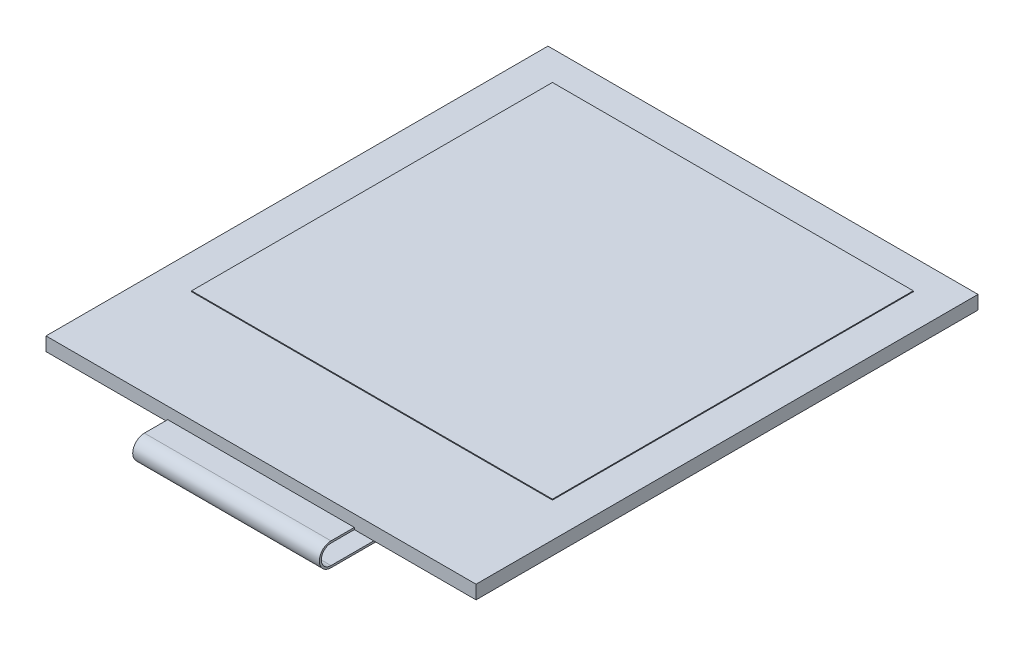
ISO-10303-21;
HEADER;
FILE_DESCRIPTION(('STEP AP214'),'2;1');
FILE_NAME('part.step','',(''),(''),'','','');
FILE_SCHEMA(('AUTOMOTIVE_DESIGN { 1 0 10303 214 1 1 1 1 }'));
ENDSEC;
DATA;
#1=APPLICATION_CONTEXT('core data for automotive mechanical design processes');
#2=APPLICATION_PROTOCOL_DEFINITION('international standard','automotive_design',2000,#1);
#3=PRODUCT_CONTEXT('',#1,'mechanical');
#4=PRODUCT('Part','Part','',(#3));
#5=PRODUCT_RELATED_PRODUCT_CATEGORY('part','',(#4));
#6=PRODUCT_DEFINITION_FORMATION('','',#4);
#7=PRODUCT_DEFINITION_CONTEXT('part definition',#1,'design');
#8=PRODUCT_DEFINITION('design','',#6,#7);
#9=PRODUCT_DEFINITION_SHAPE('','',#8);
#10=(LENGTH_UNIT() NAMED_UNIT(*) SI_UNIT(.MILLI.,.METRE.));
#11=(NAMED_UNIT(*) PLANE_ANGLE_UNIT() SI_UNIT($,.RADIAN.));
#12=(NAMED_UNIT(*) SI_UNIT($,.STERADIAN.) SOLID_ANGLE_UNIT());
#13=UNCERTAINTY_MEASURE_WITH_UNIT(LENGTH_MEASURE(1.E-05),#10,'distance_accuracy_value','');
#14=(GEOMETRIC_REPRESENTATION_CONTEXT(3) GLOBAL_UNCERTAINTY_ASSIGNED_CONTEXT((#13)) GLOBAL_UNIT_ASSIGNED_CONTEXT((#10,
#11,#12)) REPRESENTATION_CONTEXT('',''));
#15=CARTESIAN_POINT('',(0.,0.,0.));
#16=DIRECTION('',(0.,0.,1.));
#17=DIRECTION('',(1.,0.,0.));
#18=AXIS2_PLACEMENT_3D('',#15,#16,#17);
#19=CARTESIAN_POINT('',(-4.8,-1.1,16.19));
#20=DIRECTION('',(0.,-1.,0.));
#21=DIRECTION('',(0.,0.,-1.));
#22=AXIS2_PLACEMENT_3D('',#19,#20,#21);
#23=PLANE('',#22);
#24=DIRECTION('',(0.,0.,-1.));
#25=VECTOR('',#24,1.);
#26=CARTESIAN_POINT('',(-2.75,-1.1,12.76));
#27=LINE('',#26,#25);
#28=CARTESIAN_POINT('',(-2.75,-1.1,12.76));
#29=VERTEX_POINT('',#28);
#30=CARTESIAN_POINT('',(-2.75,-1.1,9.26));
#31=VERTEX_POINT('',#30);
#32=EDGE_CURVE('E59',#29,#31,#27,.T.);
#33=ORIENTED_EDGE('',*,*,#32,.T.);
#34=DIRECTION('',(-1.,0.,0.));
#35=VECTOR('',#34,1.);
#36=CARTESIAN_POINT('',(-2.75,-1.1,9.26));
#37=LINE('',#36,#35);
#38=CARTESIAN_POINT('',(2.75,-1.1,9.26));
#39=VERTEX_POINT('',#38);
#40=EDGE_CURVE('E63',#39,#31,#37,.T.);
#41=ORIENTED_EDGE('',*,*,#40,.F.);
#42=DIRECTION('',(0.,0.,1.));
#43=VECTOR('',#42,1.);
#44=CARTESIAN_POINT('',(2.75,-1.1,12.76));
#45=LINE('',#44,#43);
#46=CARTESIAN_POINT('',(2.75,-1.1,12.76));
#47=VERTEX_POINT('',#46);
#48=EDGE_CURVE('E237',#39,#47,#45,.T.);
#49=ORIENTED_EDGE('',*,*,#48,.T.);
#50=DIRECTION('',(1.,0.,0.));
#51=VECTOR('',#50,1.);
#52=CARTESIAN_POINT('',(-4.8,-1.1,12.76));
#53=LINE('',#52,#51);
#54=CARTESIAN_POINT('',(4.8,-1.1,12.76));
#55=VERTEX_POINT('',#54);
#56=EDGE_CURVE('E335',#47,#55,#53,.T.);
#57=ORIENTED_EDGE('',*,*,#56,.T.);
#58=DIRECTION('',(0.,0.,-1.));
#59=VECTOR('',#58,1.);
#60=CARTESIAN_POINT('',(4.8,-1.1,16.19));
#61=LINE('',#60,#59);
#62=CARTESIAN_POINT('',(4.8,-1.1,16.19));
#63=VERTEX_POINT('',#62);
#64=EDGE_CURVE('E268',#63,#55,#61,.T.);
#65=ORIENTED_EDGE('',*,*,#64,.F.);
#66=DIRECTION('',(1.,0.,0.));
#67=VECTOR('',#66,1.);
#68=CARTESIAN_POINT('',(-4.8,-1.1,16.19));
#69=LINE('',#68,#67);
#70=CARTESIAN_POINT('',(-4.8,-1.1,16.19));
#71=VERTEX_POINT('',#70);
#72=EDGE_CURVE('E336',#71,#63,#69,.T.);
#73=ORIENTED_EDGE('',*,*,#72,.F.);
#74=DIRECTION('',(0.,0.,-1.));
#75=VECTOR('',#74,1.);
#76=CARTESIAN_POINT('',(-4.8,-1.1,16.19));
#77=LINE('',#76,#75);
#78=CARTESIAN_POINT('',(-4.8,-1.1,12.76));
#79=VERTEX_POINT('',#78);
#80=EDGE_CURVE('E299',#71,#79,#77,.T.);
#81=ORIENTED_EDGE('',*,*,#80,.T.);
#82=EDGE_CURVE('E332',#79,#29,#53,.T.);
#83=ORIENTED_EDGE('',*,*,#82,.T.);
#84=EDGE_LOOP('',(#33,#41,#49,#57,#65,#73,#81,#83));
#85=FACE_BOUND('',#84,.T.);
#86=ADVANCED_FACE('F43',(#85),#23,.T.);
#87=CARTESIAN_POINT('',(-4.8,-1.,12.76));
#88=DIRECTION('',(0.,0.,-1.));
#89=DIRECTION('',(-1.,0.,0.));
#90=AXIS2_PLACEMENT_3D('',#87,#88,#89);
#91=PLANE('',#90);
#92=DIRECTION('',(1.,0.,0.));
#93=VECTOR('',#92,1.);
#94=CARTESIAN_POINT('',(-4.8,-1.,12.76));
#95=LINE('',#94,#93);
#96=CARTESIAN_POINT('',(-4.8,-1.,12.76));
#97=VERTEX_POINT('',#96);
#98=CARTESIAN_POINT('',(-2.75,-1.,12.76));
#99=VERTEX_POINT('',#98);
#100=EDGE_CURVE('E327',#97,#99,#95,.T.);
#101=ORIENTED_EDGE('',*,*,#100,.T.);
#102=DIRECTION('',(0.,-1.,0.));
#103=VECTOR('',#102,1.);
#104=CARTESIAN_POINT('',(-2.75,-1.,12.76));
#105=LINE('',#104,#103);
#106=EDGE_CURVE('E246',#99,#29,#105,.T.);
#107=ORIENTED_EDGE('',*,*,#106,.T.);
#108=ORIENTED_EDGE('',*,*,#82,.F.);
#109=DIRECTION('',(0.,1.,0.));
#110=VECTOR('',#109,1.);
#111=CARTESIAN_POINT('',(-4.8,-1.,12.76));
#112=LINE('',#111,#110);
#113=EDGE_CURVE('E303',#79,#97,#112,.T.);
#114=ORIENTED_EDGE('',*,*,#113,.T.);
#115=EDGE_LOOP('',(#101,#107,#108,#114));
#116=FACE_BOUND('',#115,.T.);
#117=ADVANCED_FACE('F475',(#116),#91,.T.);
#118=CARTESIAN_POINT('',(-11.06,0.7,14.99));
#119=DIRECTION('',(0.,0.,-1.));
#120=DIRECTION('',(-1.,0.,0.));
#121=AXIS2_PLACEMENT_3D('',#118,#119,#120);
#122=PLANE('',#121);
#123=DIRECTION('',(0.,1.,0.));
#124=VECTOR('',#123,1.);
#125=CARTESIAN_POINT('',(-4.8,0.,14.99));
#126=LINE('',#125,#124);
#127=CARTESIAN_POINT('',(-4.8,0.,14.99));
#128=VERTEX_POINT('',#127);
#129=CARTESIAN_POINT('',(-4.8,0.1,14.99));
#130=VERTEX_POINT('',#129);
#131=EDGE_CURVE('E287',#128,#130,#126,.T.);
#132=ORIENTED_EDGE('',*,*,#131,.T.);
#133=DIRECTION('',(1.,0.,0.));
#134=VECTOR('',#133,1.);
#135=CARTESIAN_POINT('',(-4.8,0.1,14.99));
#136=LINE('',#135,#134);
#137=CARTESIAN_POINT('',(4.8,0.1,14.99));
#138=VERTEX_POINT('',#137);
#139=EDGE_CURVE('E319',#130,#138,#136,.T.);
#140=ORIENTED_EDGE('',*,*,#139,.T.);
#141=DIRECTION('',(0.,1.,0.));
#142=VECTOR('',#141,1.);
#143=CARTESIAN_POINT('',(4.8,0.,14.99));
#144=LINE('',#143,#142);
#145=CARTESIAN_POINT('',(4.8,0.,14.99));
#146=VERTEX_POINT('',#145);
#147=EDGE_CURVE('E250',#146,#138,#144,.T.);
#148=ORIENTED_EDGE('',*,*,#147,.F.);
#149=DIRECTION('',(1.,0.,0.));
#150=VECTOR('',#149,1.);
#151=CARTESIAN_POINT('',(-11.06,0.,14.99));
#152=LINE('',#151,#150);
#153=CARTESIAN_POINT('',(11.06,0.,14.99));
#154=VERTEX_POINT('',#153);
#155=EDGE_CURVE('E410',#146,#154,#152,.T.);
#156=ORIENTED_EDGE('',*,*,#155,.T.);
#157=DIRECTION('',(0.,-1.,0.));
#158=VECTOR('',#157,1.);
#159=CARTESIAN_POINT('',(11.06,0.7,14.99));
#160=LINE('',#159,#158);
#161=CARTESIAN_POINT('',(11.06,0.7,14.99));
#162=VERTEX_POINT('',#161);
#163=EDGE_CURVE('E52',#162,#154,#160,.T.);
#164=ORIENTED_EDGE('',*,*,#163,.F.);
#165=DIRECTION('',(1.,0.,0.));
#166=VECTOR('',#165,1.);
#167=CARTESIAN_POINT('',(-11.06,0.7,14.99));
#168=LINE('',#167,#166);
#169=CARTESIAN_POINT('',(-11.06,0.7,14.99));
#170=VERTEX_POINT('',#169);
#171=EDGE_CURVE('E396',#170,#162,#168,.T.);
#172=ORIENTED_EDGE('',*,*,#171,.F.);
#173=DIRECTION('',(0.,-1.,0.));
#174=VECTOR('',#173,1.);
#175=CARTESIAN_POINT('',(-11.06,0.7,14.99));
#176=LINE('',#175,#174);
#177=CARTESIAN_POINT('',(-11.06,0.,14.99));
#178=VERTEX_POINT('',#177);
#179=EDGE_CURVE('E11',#170,#178,#176,.T.);
#180=ORIENTED_EDGE('',*,*,#179,.T.);
#181=EDGE_CURVE('E411',#178,#128,#152,.T.);
#182=ORIENTED_EDGE('',*,*,#181,.T.);
#183=EDGE_LOOP('',(#132,#140,#148,#156,#164,#172,#180,#182));
#184=FACE_BOUND('',#183,.T.);
#185=ADVANCED_FACE('F451',(#184),#122,.F.);
#186=CARTESIAN_POINT('',(0.,0.7,0.));
#187=DIRECTION('',(0.,1.,0.));
#188=DIRECTION('',(0.,0.,1.));
#189=AXIS2_PLACEMENT_3D('',#186,#187,#188);
#190=PLANE('',#189);
#191=DIRECTION('',(0.,0.,1.));
#192=VECTOR('',#191,1.);
#193=CARTESIAN_POINT('',(-11.06,0.7,-10.83));
#194=LINE('',#193,#192);
#195=CARTESIAN_POINT('',(-11.06,0.7,-10.83));
#196=VERTEX_POINT('',#195);
#197=EDGE_CURVE('E392',#196,#170,#194,.T.);
#198=ORIENTED_EDGE('',*,*,#197,.T.);
#199=ORIENTED_EDGE('',*,*,#171,.T.);
#200=DIRECTION('',(0.,0.,-1.));
#201=VECTOR('',#200,1.);
#202=CARTESIAN_POINT('',(11.06,0.7,-10.83));
#203=LINE('',#202,#201);
#204=CARTESIAN_POINT('',(11.06,0.7,-10.83));
#205=VERTEX_POINT('',#204);
#206=EDGE_CURVE('E400',#162,#205,#203,.T.);
#207=ORIENTED_EDGE('',*,*,#206,.T.);
#208=DIRECTION('',(-1.,0.,0.));
#209=VECTOR('',#208,1.);
#210=CARTESIAN_POINT('',(-11.06,0.7,-10.83));
#211=LINE('',#210,#209);
#212=EDGE_CURVE('E403',#205,#196,#211,.T.);
#213=ORIENTED_EDGE('',*,*,#212,.T.);
#214=EDGE_LOOP('',(#198,#199,#207,#213));
#215=FACE_BOUND('',#214,.T.);
#216=DIRECTION('',(-1.,0.,0.));
#217=VECTOR('',#216,1.);
#218=CARTESIAN_POINT('',(-9.28,0.7,-9.28));
#219=LINE('',#218,#217);
#220=CARTESIAN_POINT('',(9.28,0.7,-9.28));
#221=VERTEX_POINT('',#220);
#222=CARTESIAN_POINT('',(-9.28,0.7,-9.28));
#223=VERTEX_POINT('',#222);
#224=EDGE_CURVE('E379',#221,#223,#219,.T.);
#225=ORIENTED_EDGE('',*,*,#224,.F.);
#226=DIRECTION('',(0.,0.,-1.));
#227=VECTOR('',#226,1.);
#228=CARTESIAN_POINT('',(9.28,0.7,9.28));
#229=LINE('',#228,#227);
#230=CARTESIAN_POINT('',(9.28,0.7,9.28));
#231=VERTEX_POINT('',#230);
#232=EDGE_CURVE('E375',#231,#221,#229,.T.);
#233=ORIENTED_EDGE('',*,*,#232,.F.);
#234=DIRECTION('',(1.,0.,0.));
#235=VECTOR('',#234,1.);
#236=CARTESIAN_POINT('',(-9.28,0.7,9.28));
#237=LINE('',#236,#235);
#238=CARTESIAN_POINT('',(-9.28,0.7,9.28));
#239=VERTEX_POINT('',#238);
#240=EDGE_CURVE('E387',#239,#231,#237,.T.);
#241=ORIENTED_EDGE('',*,*,#240,.F.);
#242=DIRECTION('',(0.,0.,1.));
#243=VECTOR('',#242,1.);
#244=CARTESIAN_POINT('',(-9.28,0.7,9.28));
#245=LINE('',#244,#243);
#246=EDGE_CURVE('E383',#223,#239,#245,.T.);
#247=ORIENTED_EDGE('',*,*,#246,.F.);
#248=EDGE_LOOP('',(#225,#233,#241,#247));
#249=FACE_BOUND('',#248,.T.);
#250=ADVANCED_FACE('F449',(#215,#249),#190,.T.);
#251=CARTESIAN_POINT('',(0.,0.,0.));
#252=DIRECTION('',(0.,1.,0.));
#253=DIRECTION('',(0.,0.,1.));
#254=AXIS2_PLACEMENT_3D('',#251,#252,#253);
#255=PLANE('',#254);
#256=DIRECTION('',(0.,0.,1.));
#257=VECTOR('',#256,1.);
#258=CARTESIAN_POINT('',(-11.06,0.,-10.83));
#259=LINE('',#258,#257);
#260=CARTESIAN_POINT('',(-11.06,0.,-10.83));
#261=VERTEX_POINT('',#260);
#262=EDGE_CURVE('E391',#261,#178,#259,.T.);
#263=ORIENTED_EDGE('',*,*,#262,.F.);
#264=DIRECTION('',(-1.,0.,0.));
#265=VECTOR('',#264,1.);
#266=CARTESIAN_POINT('',(-11.06,0.,-10.83));
#267=LINE('',#266,#265);
#268=CARTESIAN_POINT('',(11.06,0.,-10.83));
#269=VERTEX_POINT('',#268);
#270=EDGE_CURVE('E397',#269,#261,#267,.T.);
#271=ORIENTED_EDGE('',*,*,#270,.F.);
#272=DIRECTION('',(0.,0.,-1.));
#273=VECTOR('',#272,1.);
#274=CARTESIAN_POINT('',(11.06,0.,-10.83));
#275=LINE('',#274,#273);
#276=EDGE_CURVE('E415',#154,#269,#275,.T.);
#277=ORIENTED_EDGE('',*,*,#276,.F.);
#278=ORIENTED_EDGE('',*,*,#155,.F.);
#279=DIRECTION('',(0.,0.,-1.));
#280=VECTOR('',#279,1.);
#281=CARTESIAN_POINT('',(4.8,0.,14.99));
#282=LINE('',#281,#280);
#283=CARTESIAN_POINT('',(4.8,0.,16.19));
#284=VERTEX_POINT('',#283);
#285=EDGE_CURVE('E284',#284,#146,#282,.T.);
#286=ORIENTED_EDGE('',*,*,#285,.F.);
#287=DIRECTION('',(1.,0.,0.));
#288=VECTOR('',#287,1.);
#289=CARTESIAN_POINT('',(-4.8,0.,16.19));
#290=LINE('',#289,#288);
#291=CARTESIAN_POINT('',(-4.8,0.,16.19));
#292=VERTEX_POINT('',#291);
#293=EDGE_CURVE('E320',#292,#284,#290,.T.);
#294=ORIENTED_EDGE('',*,*,#293,.F.);
#295=DIRECTION('',(0.,0.,-1.));
#296=VECTOR('',#295,1.);
#297=CARTESIAN_POINT('',(-4.8,0.,14.99));
#298=LINE('',#297,#296);
#299=EDGE_CURVE('E315',#292,#128,#298,.T.);
#300=ORIENTED_EDGE('',*,*,#299,.T.);
#301=ORIENTED_EDGE('',*,*,#181,.F.);
#302=EDGE_LOOP('',(#263,#271,#277,#278,#286,#294,#300,#301));
#303=FACE_BOUND('',#302,.T.);
#304=ADVANCED_FACE('F439',(#303),#255,.F.);
#305=CARTESIAN_POINT('',(-11.06,0.7,-10.83));
#306=DIRECTION('',(1.,0.,0.));
#307=DIRECTION('',(0.,0.,-1.));
#308=AXIS2_PLACEMENT_3D('',#305,#306,#307);
#309=PLANE('',#308);
#310=ORIENTED_EDGE('',*,*,#262,.T.);
#311=ORIENTED_EDGE('',*,*,#179,.F.);
#312=ORIENTED_EDGE('',*,*,#197,.F.);
#313=DIRECTION('',(0.,-1.,0.));
#314=VECTOR('',#313,1.);
#315=CARTESIAN_POINT('',(-11.06,0.7,-10.83));
#316=LINE('',#315,#314);
#317=EDGE_CURVE('E406',#196,#261,#316,.T.);
#318=ORIENTED_EDGE('',*,*,#317,.T.);
#319=EDGE_LOOP('',(#310,#311,#312,#318));
#320=FACE_BOUND('',#319,.T.);
#321=ADVANCED_FACE('F45',(#320),#309,.F.);
#322=CARTESIAN_POINT('',(11.06,0.7,-10.83));
#323=DIRECTION('',(-1.,0.,0.));
#324=DIRECTION('',(0.,0.,1.));
#325=AXIS2_PLACEMENT_3D('',#322,#323,#324);
#326=PLANE('',#325);
#327=ORIENTED_EDGE('',*,*,#276,.T.);
#328=DIRECTION('',(0.,-1.,0.));
#329=VECTOR('',#328,1.);
#330=CARTESIAN_POINT('',(11.06,0.7,-10.83));
#331=LINE('',#330,#329);
#332=EDGE_CURVE('E423',#205,#269,#331,.T.);
#333=ORIENTED_EDGE('',*,*,#332,.F.);
#334=ORIENTED_EDGE('',*,*,#206,.F.);
#335=ORIENTED_EDGE('',*,*,#163,.T.);
#336=EDGE_LOOP('',(#327,#333,#334,#335));
#337=FACE_BOUND('',#336,.T.);
#338=ADVANCED_FACE('F432',(#337),#326,.F.);
#339=CARTESIAN_POINT('',(-11.06,0.7,-10.83));
#340=DIRECTION('',(0.,0.,1.));
#341=DIRECTION('',(1.,0.,0.));
#342=AXIS2_PLACEMENT_3D('',#339,#340,#341);
#343=PLANE('',#342);
#344=ORIENTED_EDGE('',*,*,#270,.T.);
#345=ORIENTED_EDGE('',*,*,#317,.F.);
#346=ORIENTED_EDGE('',*,*,#212,.F.);
#347=ORIENTED_EDGE('',*,*,#332,.T.);
#348=EDGE_LOOP('',(#344,#345,#346,#347));
#349=FACE_BOUND('',#348,.T.);
#350=ADVANCED_FACE('F443',(#349),#343,.F.);
#351=CARTESIAN_POINT('',(0.,0.745,9.28));
#352=DIRECTION('',(0.,0.,-1.));
#353=DIRECTION('',(-1.,0.,0.));
#354=AXIS2_PLACEMENT_3D('',#351,#352,#353);
#355=PLANE('',#354);
#356=ORIENTED_EDGE('',*,*,#240,.T.);
#357=DIRECTION('',(0.,-1.,0.));
#358=VECTOR('',#357,1.);
#359=CARTESIAN_POINT('',(9.28,0.745,9.28));
#360=LINE('',#359,#358);
#361=CARTESIAN_POINT('',(9.28,0.745,9.28));
#362=VERTEX_POINT('',#361);
#363=EDGE_CURVE('E371',#362,#231,#360,.T.);
#364=ORIENTED_EDGE('',*,*,#363,.F.);
#365=DIRECTION('',(1.,0.,0.));
#366=VECTOR('',#365,1.);
#367=CARTESIAN_POINT('',(0.,0.745,9.28));
#368=LINE('',#367,#366);
#369=CARTESIAN_POINT('',(-9.28,0.745,9.28));
#370=VERTEX_POINT('',#369);
#371=EDGE_CURVE('E323',#370,#362,#368,.T.);
#372=ORIENTED_EDGE('',*,*,#371,.F.);
#373=DIRECTION('',(0.,-1.,0.));
#374=VECTOR('',#373,1.);
#375=CARTESIAN_POINT('',(-9.28,0.745,9.28));
#376=LINE('',#375,#374);
#377=EDGE_CURVE('E359',#370,#239,#376,.T.);
#378=ORIENTED_EDGE('',*,*,#377,.T.);
#379=EDGE_LOOP('',(#356,#364,#372,#378));
#380=FACE_BOUND('',#379,.T.);
#381=ADVANCED_FACE('F530',(#380),#355,.F.);
#382=CARTESIAN_POINT('',(9.28,0.745,0.));
#383=DIRECTION('',(-1.,0.,0.));
#384=DIRECTION('',(0.,0.,1.));
#385=AXIS2_PLACEMENT_3D('',#382,#383,#384);
#386=PLANE('',#385);
#387=ORIENTED_EDGE('',*,*,#232,.T.);
#388=DIRECTION('',(0.,-1.,0.));
#389=VECTOR('',#388,1.);
#390=CARTESIAN_POINT('',(9.28,0.745,-9.28));
#391=LINE('',#390,#389);
#392=CARTESIAN_POINT('',(9.28,0.745,-9.28));
#393=VERTEX_POINT('',#392);
#394=EDGE_CURVE('E367',#393,#221,#391,.T.);
#395=ORIENTED_EDGE('',*,*,#394,.F.);
#396=DIRECTION('',(0.,0.,-1.));
#397=VECTOR('',#396,1.);
#398=CARTESIAN_POINT('',(9.28,0.745,0.));
#399=LINE('',#398,#397);
#400=EDGE_CURVE('E348',#362,#393,#399,.T.);
#401=ORIENTED_EDGE('',*,*,#400,.F.);
#402=ORIENTED_EDGE('',*,*,#363,.T.);
#403=EDGE_LOOP('',(#387,#395,#401,#402));
#404=FACE_BOUND('',#403,.T.);
#405=ADVANCED_FACE('F526',(#404),#386,.F.);
#406=CARTESIAN_POINT('',(0.,0.745,-9.28));
#407=DIRECTION('',(0.,0.,-1.));
#408=DIRECTION('',(-1.,0.,0.));
#409=AXIS2_PLACEMENT_3D('',#406,#407,#408);
#410=PLANE('',#409);
#411=ORIENTED_EDGE('',*,*,#394,.T.);
#412=ORIENTED_EDGE('',*,*,#224,.T.);
#413=DIRECTION('',(0.,-1.,0.));
#414=VECTOR('',#413,1.);
#415=CARTESIAN_POINT('',(-9.28,0.745,-9.28));
#416=LINE('',#415,#414);
#417=CARTESIAN_POINT('',(-9.28,0.745,-9.28));
#418=VERTEX_POINT('',#417);
#419=EDGE_CURVE('E363',#418,#223,#416,.T.);
#420=ORIENTED_EDGE('',*,*,#419,.F.);
#421=DIRECTION('',(1.,0.,0.));
#422=VECTOR('',#421,1.);
#423=CARTESIAN_POINT('',(0.,0.745,-9.28));
#424=LINE('',#423,#422);
#425=EDGE_CURVE('E351',#418,#393,#424,.T.);
#426=ORIENTED_EDGE('',*,*,#425,.T.);
#427=EDGE_LOOP('',(#411,#412,#420,#426));
#428=FACE_BOUND('',#427,.T.);
#429=ADVANCED_FACE('F522',(#428),#410,.T.);
#430=CARTESIAN_POINT('',(-9.28,0.745,0.));
#431=DIRECTION('',(-1.,0.,0.));
#432=DIRECTION('',(0.,0.,1.));
#433=AXIS2_PLACEMENT_3D('',#430,#431,#432);
#434=PLANE('',#433);
#435=ORIENTED_EDGE('',*,*,#419,.T.);
#436=ORIENTED_EDGE('',*,*,#246,.T.);
#437=ORIENTED_EDGE('',*,*,#377,.F.);
#438=DIRECTION('',(0.,0.,-1.));
#439=VECTOR('',#438,1.);
#440=CARTESIAN_POINT('',(-9.28,0.745,0.));
#441=LINE('',#440,#439);
#442=EDGE_CURVE('E355',#370,#418,#441,.T.);
#443=ORIENTED_EDGE('',*,*,#442,.T.);
#444=EDGE_LOOP('',(#435,#436,#437,#443));
#445=FACE_BOUND('',#444,.T.);
#446=ADVANCED_FACE('F518',(#445),#434,.T.);
#447=CARTESIAN_POINT('',(0.,0.745,0.));
#448=DIRECTION('',(0.,1.,0.));
#449=DIRECTION('',(0.,0.,1.));
#450=AXIS2_PLACEMENT_3D('',#447,#448,#449);
#451=PLANE('',#450);
#452=ORIENTED_EDGE('',*,*,#371,.T.);
#453=ORIENTED_EDGE('',*,*,#400,.T.);
#454=ORIENTED_EDGE('',*,*,#425,.F.);
#455=ORIENTED_EDGE('',*,*,#442,.F.);
#456=EDGE_LOOP('',(#452,#453,#454,#455));
#457=FACE_BOUND('',#456,.T.);
#458=ADVANCED_FACE('F515',(#457),#451,.T.);
#459=CARTESIAN_POINT('',(-4.8,-0.5,16.19));
#460=DIRECTION('',(1.,0.,0.));
#461=DIRECTION('',(0.,0.,-1.));
#462=AXIS2_PLACEMENT_3D('',#459,#460,#461);
#463=CYLINDRICAL_SURFACE('',#462,0.5);
#464=ORIENTED_EDGE('',*,*,#293,.T.);
#465=CARTESIAN_POINT('',(4.8,-0.5,16.19));
#466=DIRECTION('',(-1.,0.,0.));
#467=DIRECTION('',(0.,0.,-1.));
#468=AXIS2_PLACEMENT_3D('',#465,#466,#467);
#469=CIRCLE('',#468,0.5);
#470=CARTESIAN_POINT('',(4.8,-1.,16.19));
#471=VERTEX_POINT('',#470);
#472=EDGE_CURVE('E280',#471,#284,#469,.T.);
#473=ORIENTED_EDGE('',*,*,#472,.F.);
#474=DIRECTION('',(1.,0.,0.));
#475=VECTOR('',#474,1.);
#476=CARTESIAN_POINT('',(-4.8,-1.,16.19));
#477=LINE('',#476,#475);
#478=CARTESIAN_POINT('',(-4.8,-1.,16.19));
#479=VERTEX_POINT('',#478);
#480=EDGE_CURVE('E324',#479,#471,#477,.T.);
#481=ORIENTED_EDGE('',*,*,#480,.F.);
#482=CARTESIAN_POINT('',(-4.8,-0.5,16.19));
#483=DIRECTION('',(-1.,0.,0.));
#484=DIRECTION('',(0.,0.,-1.));
#485=AXIS2_PLACEMENT_3D('',#482,#483,#484);
#486=CIRCLE('',#485,0.5);
#487=EDGE_CURVE('E311',#479,#292,#486,.T.);
#488=ORIENTED_EDGE('',*,*,#487,.T.);
#489=EDGE_LOOP('',(#464,#473,#481,#488));
#490=FACE_BOUND('',#489,.T.);
#491=ADVANCED_FACE('F469',(#490),#463,.F.);
#492=CARTESIAN_POINT('',(-4.8,-1.,16.19));
#493=DIRECTION('',(0.,1.,0.));
#494=DIRECTION('',(0.,0.,1.));
#495=AXIS2_PLACEMENT_3D('',#492,#493,#494);
#496=PLANE('',#495);
#497=ORIENTED_EDGE('',*,*,#480,.T.);
#498=DIRECTION('',(0.,0.,1.));
#499=VECTOR('',#498,1.);
#500=CARTESIAN_POINT('',(4.8,-1.,16.19));
#501=LINE('',#500,#499);
#502=CARTESIAN_POINT('',(4.8,-1.,12.76));
#503=VERTEX_POINT('',#502);
#504=EDGE_CURVE('E276',#503,#471,#501,.T.);
#505=ORIENTED_EDGE('',*,*,#504,.F.);
#506=CARTESIAN_POINT('',(2.75,-1.,12.76));
#507=VERTEX_POINT('',#506);
#508=EDGE_CURVE('E331',#507,#503,#95,.T.);
#509=ORIENTED_EDGE('',*,*,#508,.F.);
#510=DIRECTION('',(0.,0.,1.));
#511=VECTOR('',#510,1.);
#512=CARTESIAN_POINT('',(2.75,-1.,12.76));
#513=LINE('',#512,#511);
#514=CARTESIAN_POINT('',(2.75,-1.,4.76));
#515=VERTEX_POINT('',#514);
#516=EDGE_CURVE('E204',#515,#507,#513,.T.);
#517=ORIENTED_EDGE('',*,*,#516,.F.);
#518=DIRECTION('',(1.,0.,0.));
#519=VECTOR('',#518,1.);
#520=CARTESIAN_POINT('',(-2.75,-1.,4.76));
#521=LINE('',#520,#519);
#522=CARTESIAN_POINT('',(-2.75,-1.,4.76));
#523=VERTEX_POINT('',#522);
#524=EDGE_CURVE('E236',#523,#515,#521,.T.);
#525=ORIENTED_EDGE('',*,*,#524,.F.);
#526=DIRECTION('',(0.,0.,-1.));
#527=VECTOR('',#526,1.);
#528=CARTESIAN_POINT('',(-2.75,-1.,12.76));
#529=LINE('',#528,#527);
#530=EDGE_CURVE('E198',#99,#523,#529,.T.);
#531=ORIENTED_EDGE('',*,*,#530,.F.);
#532=ORIENTED_EDGE('',*,*,#100,.F.);
#533=DIRECTION('',(0.,0.,1.));
#534=VECTOR('',#533,1.);
#535=CARTESIAN_POINT('',(-4.8,-1.,16.19));
#536=LINE('',#535,#534);
#537=EDGE_CURVE('E307',#97,#479,#536,.T.);
#538=ORIENTED_EDGE('',*,*,#537,.T.);
#539=EDGE_LOOP('',(#497,#505,#509,#517,#525,#531,#532,#538));
#540=FACE_BOUND('',#539,.T.);
#541=ADVANCED_FACE('F471',(#540),#496,.T.);
#542=DIRECTION('',(0.,-1.,0.));
#543=VECTOR('',#542,1.);
#544=CARTESIAN_POINT('',(2.75,-1.,12.76));
#545=LINE('',#544,#543);
#546=EDGE_CURVE('E251',#507,#47,#545,.T.);
#547=ORIENTED_EDGE('',*,*,#546,.F.);
#548=ORIENTED_EDGE('',*,*,#508,.T.);
#549=DIRECTION('',(0.,1.,0.));
#550=VECTOR('',#549,1.);
#551=CARTESIAN_POINT('',(4.8,-1.,12.76));
#552=LINE('',#551,#550);
#553=EDGE_CURVE('E272',#55,#503,#552,.T.);
#554=ORIENTED_EDGE('',*,*,#553,.F.);
#555=ORIENTED_EDGE('',*,*,#56,.F.);
#556=EDGE_LOOP('',(#547,#548,#554,#555));
#557=FACE_BOUND('',#556,.T.);
#558=ADVANCED_FACE('F486',(#557),#91,.T.);
#559=CARTESIAN_POINT('',(-4.8,-0.5,16.19));
#560=DIRECTION('',(1.,0.,0.));
#561=DIRECTION('',(0.,0.,-1.));
#562=AXIS2_PLACEMENT_3D('',#559,#560,#561);
#563=CYLINDRICAL_SURFACE('',#562,0.6);
#564=ORIENTED_EDGE('',*,*,#72,.T.);
#565=CARTESIAN_POINT('',(4.8,-0.5,16.19));
#566=DIRECTION('',(1.,0.,0.));
#567=DIRECTION('',(0.,0.,-1.));
#568=AXIS2_PLACEMENT_3D('',#565,#566,#567);
#569=CIRCLE('',#568,0.6);
#570=CARTESIAN_POINT('',(4.8,0.0999999999999998,16.19));
#571=VERTEX_POINT('',#570);
#572=EDGE_CURVE('E264',#571,#63,#569,.T.);
#573=ORIENTED_EDGE('',*,*,#572,.F.);
#574=DIRECTION('',(1.,0.,0.));
#575=VECTOR('',#574,1.);
#576=CARTESIAN_POINT('',(-4.8,0.0999999999999998,16.19));
#577=LINE('',#576,#575);
#578=CARTESIAN_POINT('',(-4.8,0.0999999999999998,16.19));
#579=VERTEX_POINT('',#578);
#580=EDGE_CURVE('E339',#579,#571,#577,.T.);
#581=ORIENTED_EDGE('',*,*,#580,.F.);
#582=CARTESIAN_POINT('',(-4.8,-0.5,16.19));
#583=DIRECTION('',(1.,0.,0.));
#584=DIRECTION('',(0.,0.,-1.));
#585=AXIS2_PLACEMENT_3D('',#582,#583,#584);
#586=CIRCLE('',#585,0.6);
#587=EDGE_CURVE('E295',#579,#71,#586,.T.);
#588=ORIENTED_EDGE('',*,*,#587,.T.);
#589=EDGE_LOOP('',(#564,#573,#581,#588));
#590=FACE_BOUND('',#589,.T.);
#591=ADVANCED_FACE('F478',(#590),#563,.T.);
#592=CARTESIAN_POINT('',(-4.8,0.1,14.99));
#593=DIRECTION('',(0.,1.,0.));
#594=DIRECTION('',(0.,0.,1.));
#595=AXIS2_PLACEMENT_3D('',#592,#593,#594);
#596=PLANE('',#595);
#597=ORIENTED_EDGE('',*,*,#580,.T.);
#598=DIRECTION('',(0.,0.,1.));
#599=VECTOR('',#598,1.);
#600=CARTESIAN_POINT('',(4.8,0.1,14.99));
#601=LINE('',#600,#599);
#602=EDGE_CURVE('E260',#138,#571,#601,.T.);
#603=ORIENTED_EDGE('',*,*,#602,.F.);
#604=ORIENTED_EDGE('',*,*,#139,.F.);
#605=DIRECTION('',(0.,0.,1.));
#606=VECTOR('',#605,1.);
#607=CARTESIAN_POINT('',(-4.8,0.1,14.99));
#608=LINE('',#607,#606);
#609=EDGE_CURVE('E291',#130,#579,#608,.T.);
#610=ORIENTED_EDGE('',*,*,#609,.T.);
#611=EDGE_LOOP('',(#597,#603,#604,#610));
#612=FACE_BOUND('',#611,.T.);
#613=ADVANCED_FACE('F461',(#612),#596,.T.);
#614=CARTESIAN_POINT('',(-4.8,-0.5,16.19));
#615=DIRECTION('',(1.,0.,0.));
#616=DIRECTION('',(0.,0.,-1.));
#617=AXIS2_PLACEMENT_3D('',#614,#615,#616);
#618=PLANE('',#617);
#619=ORIENTED_EDGE('',*,*,#131,.F.);
#620=ORIENTED_EDGE('',*,*,#299,.F.);
#621=ORIENTED_EDGE('',*,*,#487,.F.);
#622=ORIENTED_EDGE('',*,*,#537,.F.);
#623=ORIENTED_EDGE('',*,*,#113,.F.);
#624=ORIENTED_EDGE('',*,*,#80,.F.);
#625=ORIENTED_EDGE('',*,*,#587,.F.);
#626=ORIENTED_EDGE('',*,*,#609,.F.);
#627=EDGE_LOOP('',(#619,#620,#621,#622,#623,#624,#625,#626));
#628=FACE_BOUND('',#627,.T.);
#629=ADVANCED_FACE('F455',(#628),#618,.F.);
#630=CARTESIAN_POINT('',(4.8,-0.5,16.19));
#631=DIRECTION('',(1.,0.,0.));
#632=DIRECTION('',(0.,0.,-1.));
#633=AXIS2_PLACEMENT_3D('',#630,#631,#632);
#634=PLANE('',#633);
#635=ORIENTED_EDGE('',*,*,#147,.T.);
#636=ORIENTED_EDGE('',*,*,#602,.T.);
#637=ORIENTED_EDGE('',*,*,#572,.T.);
#638=ORIENTED_EDGE('',*,*,#64,.T.);
#639=ORIENTED_EDGE('',*,*,#553,.T.);
#640=ORIENTED_EDGE('',*,*,#504,.T.);
#641=ORIENTED_EDGE('',*,*,#472,.T.);
#642=ORIENTED_EDGE('',*,*,#285,.T.);
#643=EDGE_LOOP('',(#635,#636,#637,#638,#639,#640,#641,#642));
#644=FACE_BOUND('',#643,.T.);
#645=ADVANCED_FACE('F464',(#644),#634,.T.);
#646=CARTESIAN_POINT('',(-2.75,-1.,12.76));
#647=DIRECTION('',(-1.,0.,0.));
#648=DIRECTION('',(0.,0.,1.));
#649=AXIS2_PLACEMENT_3D('',#646,#647,#648);
#650=PLANE('',#649);
#651=ORIENTED_EDGE('',*,*,#32,.F.);
#652=ORIENTED_EDGE('',*,*,#106,.F.);
#653=ORIENTED_EDGE('',*,*,#530,.T.);
#654=DIRECTION('',(0.,-1.,0.));
#655=VECTOR('',#654,1.);
#656=CARTESIAN_POINT('',(-2.75,-1.,4.76));
#657=LINE('',#656,#655);
#658=CARTESIAN_POINT('',(-2.75,-1.3,4.76));
#659=VERTEX_POINT('',#658);
#660=EDGE_CURVE('E191',#523,#659,#657,.T.);
#661=ORIENTED_EDGE('',*,*,#660,.T.);
#662=DIRECTION('',(0.,0.,-1.));
#663=VECTOR('',#662,1.);
#664=CARTESIAN_POINT('',(-2.75,-1.3,4.76));
#665=LINE('',#664,#663);
#666=CARTESIAN_POINT('',(-2.75,-1.3,9.26));
#667=VERTEX_POINT('',#666);
#668=EDGE_CURVE('E196',#667,#659,#665,.T.);
#669=ORIENTED_EDGE('',*,*,#668,.F.);
#670=DIRECTION('',(0.,1.,0.));
#671=VECTOR('',#670,1.);
#672=CARTESIAN_POINT('',(-2.75,-1.3,9.26));
#673=LINE('',#672,#671);
#674=EDGE_CURVE('E226',#667,#31,#673,.T.);
#675=ORIENTED_EDGE('',*,*,#674,.T.);
#676=EDGE_LOOP('',(#651,#652,#653,#661,#669,#675));
#677=FACE_BOUND('',#676,.T.);
#678=ADVANCED_FACE('F193',(#677),#650,.T.);
#679=CARTESIAN_POINT('',(2.75,-1.,12.76));
#680=DIRECTION('',(1.,0.,0.));
#681=DIRECTION('',(0.,0.,-1.));
#682=AXIS2_PLACEMENT_3D('',#679,#680,#681);
#683=PLANE('',#682);
#684=ORIENTED_EDGE('',*,*,#48,.F.);
#685=DIRECTION('',(0.,1.,0.));
#686=VECTOR('',#685,1.);
#687=CARTESIAN_POINT('',(2.75,-1.3,9.26));
#688=LINE('',#687,#686);
#689=CARTESIAN_POINT('',(2.75,-1.3,9.26));
#690=VERTEX_POINT('',#689);
#691=EDGE_CURVE('E230',#690,#39,#688,.T.);
#692=ORIENTED_EDGE('',*,*,#691,.F.);
#693=DIRECTION('',(0.,0.,1.));
#694=VECTOR('',#693,1.);
#695=CARTESIAN_POINT('',(2.75,-1.3,4.76));
#696=LINE('',#695,#694);
#697=CARTESIAN_POINT('',(2.75,-1.3,4.76));
#698=VERTEX_POINT('',#697);
#699=EDGE_CURVE('E212',#698,#690,#696,.T.);
#700=ORIENTED_EDGE('',*,*,#699,.F.);
#701=DIRECTION('',(0.,-1.,0.));
#702=VECTOR('',#701,1.);
#703=CARTESIAN_POINT('',(2.75,-1.,4.76));
#704=LINE('',#703,#702);
#705=EDGE_CURVE('E203',#515,#698,#704,.T.);
#706=ORIENTED_EDGE('',*,*,#705,.F.);
#707=ORIENTED_EDGE('',*,*,#516,.T.);
#708=ORIENTED_EDGE('',*,*,#546,.T.);
#709=EDGE_LOOP('',(#684,#692,#700,#706,#707,#708));
#710=FACE_BOUND('',#709,.T.);
#711=ADVANCED_FACE('F489',(#710),#683,.T.);
#712=CARTESIAN_POINT('',(-2.75,-1.,4.76));
#713=DIRECTION('',(0.,0.,-1.));
#714=DIRECTION('',(-1.,0.,0.));
#715=AXIS2_PLACEMENT_3D('',#712,#713,#714);
#716=PLANE('',#715);
#717=ORIENTED_EDGE('',*,*,#705,.T.);
#718=DIRECTION('',(1.,0.,0.));
#719=VECTOR('',#718,1.);
#720=CARTESIAN_POINT('',(-2.75,-1.3,4.76));
#721=LINE('',#720,#719);
#722=EDGE_CURVE('E207',#659,#698,#721,.T.);
#723=ORIENTED_EDGE('',*,*,#722,.F.);
#724=ORIENTED_EDGE('',*,*,#660,.F.);
#725=ORIENTED_EDGE('',*,*,#524,.T.);
#726=EDGE_LOOP('',(#717,#723,#724,#725));
#727=FACE_BOUND('',#726,.T.);
#728=ADVANCED_FACE('F208',(#727),#716,.T.);
#729=CARTESIAN_POINT('',(-2.75,-1.3,9.26));
#730=DIRECTION('',(0.,0.,-1.));
#731=DIRECTION('',(-1.,0.,0.));
#732=AXIS2_PLACEMENT_3D('',#729,#730,#731);
#733=PLANE('',#732);
#734=ORIENTED_EDGE('',*,*,#40,.T.);
#735=ORIENTED_EDGE('',*,*,#674,.F.);
#736=DIRECTION('',(-1.,0.,0.));
#737=VECTOR('',#736,1.);
#738=CARTESIAN_POINT('',(-2.75,-1.3,9.26));
#739=LINE('',#738,#737);
#740=EDGE_CURVE('E216',#690,#667,#739,.T.);
#741=ORIENTED_EDGE('',*,*,#740,.F.);
#742=ORIENTED_EDGE('',*,*,#691,.T.);
#743=EDGE_LOOP('',(#734,#735,#741,#742));
#744=FACE_BOUND('',#743,.T.);
#745=ADVANCED_FACE('F492',(#744),#733,.F.);
#746=CARTESIAN_POINT('',(0.,-1.3,0.));
#747=DIRECTION('',(0.,1.,0.));
#748=DIRECTION('',(0.,0.,1.));
#749=AXIS2_PLACEMENT_3D('',#746,#747,#748);
#750=PLANE('',#749);
#751=ORIENTED_EDGE('',*,*,#668,.T.);
#752=ORIENTED_EDGE('',*,*,#722,.T.);
#753=ORIENTED_EDGE('',*,*,#699,.T.);
#754=ORIENTED_EDGE('',*,*,#740,.T.);
#755=EDGE_LOOP('',(#751,#752,#753,#754));
#756=FACE_BOUND('',#755,.T.);
#757=ADVANCED_FACE('F214',(#756),#750,.F.);
#758=CLOSED_SHELL('',(#86,#117,#185,#250,#304,#321,#338,#350,#381,#405,#429,#446,#458,#491,#541,
#558,#591,#613,#629,#645,#678,#711,#728,#745,#757));
#759=MANIFOLD_SOLID_BREP('B2',#758);
#760=ADVANCED_BREP_SHAPE_REPRESENTATION('',(#18,#759),#14);
#761=SHAPE_DEFINITION_REPRESENTATION(#9,#760);
ENDSEC;
END-ISO-10303-21;
